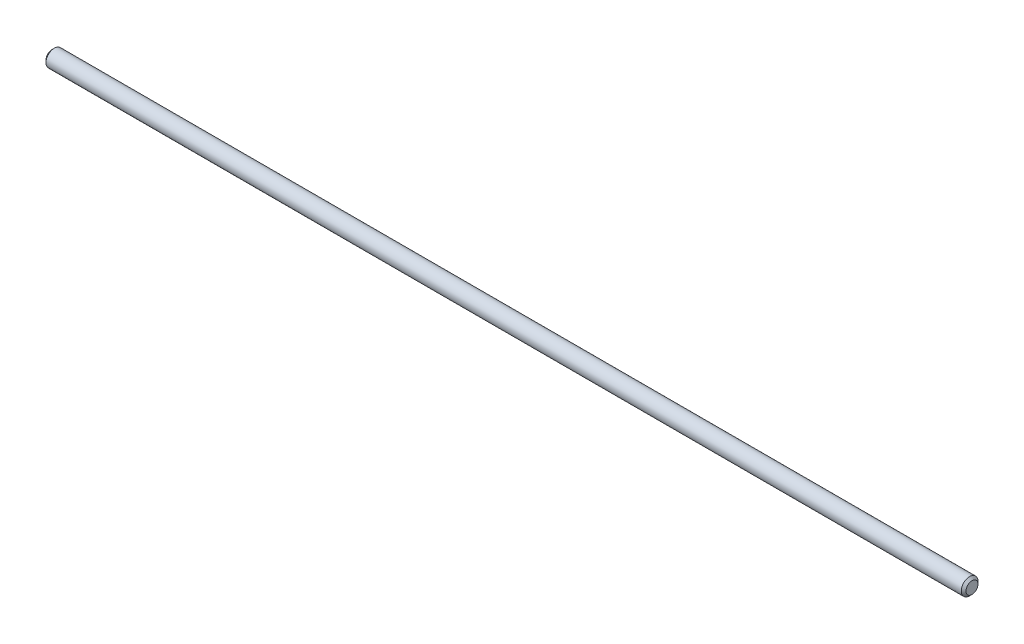
ISO-10303-21;
HEADER;
FILE_DESCRIPTION(('STEP AP214'),'2;1');
FILE_NAME('part.step','',(''),(''),'','','');
FILE_SCHEMA(('AUTOMOTIVE_DESIGN { 1 0 10303 214 1 1 1 1 }'));
ENDSEC;
DATA;
#1=APPLICATION_CONTEXT('core data for automotive mechanical design processes');
#2=APPLICATION_PROTOCOL_DEFINITION('international standard','automotive_design',2000,#1);
#3=PRODUCT_CONTEXT('',#1,'mechanical');
#4=PRODUCT('Part','Part','',(#3));
#5=PRODUCT_RELATED_PRODUCT_CATEGORY('part','',(#4));
#6=PRODUCT_DEFINITION_FORMATION('','',#4);
#7=PRODUCT_DEFINITION_CONTEXT('part definition',#1,'design');
#8=PRODUCT_DEFINITION('design','',#6,#7);
#9=PRODUCT_DEFINITION_SHAPE('','',#8);
#10=(LENGTH_UNIT() NAMED_UNIT(*) SI_UNIT(.MILLI.,.METRE.));
#11=(NAMED_UNIT(*) PLANE_ANGLE_UNIT() SI_UNIT($,.RADIAN.));
#12=(NAMED_UNIT(*) SI_UNIT($,.STERADIAN.) SOLID_ANGLE_UNIT());
#13=UNCERTAINTY_MEASURE_WITH_UNIT(LENGTH_MEASURE(1.E-05),#10,'distance_accuracy_value','');
#14=(GEOMETRIC_REPRESENTATION_CONTEXT(3) GLOBAL_UNCERTAINTY_ASSIGNED_CONTEXT((#13)) GLOBAL_UNIT_ASSIGNED_CONTEXT((#10,
#11,#12)) REPRESENTATION_CONTEXT('',''));
#15=CARTESIAN_POINT('',(0.,0.,0.));
#16=DIRECTION('',(0.,0.,1.));
#17=DIRECTION('',(1.,0.,0.));
#18=AXIS2_PLACEMENT_3D('',#15,#16,#17);
#19=CARTESIAN_POINT('',(-114.3,0.,0.));
#20=DIRECTION('',(1.,0.,0.));
#21=DIRECTION('',(0.,0.,-1.));
#22=AXIS2_PLACEMENT_3D('',#19,#20,#21);
#23=CYLINDRICAL_SURFACE('',#22,2.0828);
#24=CARTESIAN_POINT('',(-113.7046875,0.,0.));
#25=DIRECTION('',(1.,0.,0.));
#26=DIRECTION('',(0.,0.,-1.));
#27=AXIS2_PLACEMENT_3D('',#24,#25,#26);
#28=CIRCLE('',#27,2.0828);
#29=CARTESIAN_POINT('',(-113.7046875,0.,-2.0828));
#30=VERTEX_POINT('',#29);
#31=EDGE_CURVE('E50',#30,#30,#28,.T.);
#32=ORIENTED_EDGE('',*,*,#31,.T.);
#33=EDGE_LOOP('',(#32));
#34=FACE_BOUND('',#33,.T.);
#35=CARTESIAN_POINT('',(113.7046875,0.,0.));
#36=DIRECTION('',(1.,0.,0.));
#37=DIRECTION('',(0.,0.,-1.));
#38=AXIS2_PLACEMENT_3D('',#35,#36,#37);
#39=CIRCLE('',#38,2.0828);
#40=CARTESIAN_POINT('',(113.7046875,0.,-2.0828));
#41=VERTEX_POINT('',#40);
#42=EDGE_CURVE('E55',#41,#41,#39,.F.);
#43=ORIENTED_EDGE('',*,*,#42,.T.);
#44=EDGE_LOOP('',(#43));
#45=FACE_BOUND('',#44,.T.);
#46=ADVANCED_FACE('F37',(#34,#45),#23,.T.);
#47=CARTESIAN_POINT('',(-114.3,0.,0.));
#48=DIRECTION('',(1.,0.,0.));
#49=DIRECTION('',(0.,0.,-1.));
#50=AXIS2_PLACEMENT_3D('',#47,#48,#49);
#51=PLANE('',#50);
#52=CARTESIAN_POINT('',(-114.3,0.,0.));
#53=DIRECTION('',(1.,0.,0.));
#54=DIRECTION('',(0.,0.,-1.));
#55=AXIS2_PLACEMENT_3D('',#52,#53,#54);
#56=CIRCLE('',#55,1.48748750000005);
#57=CARTESIAN_POINT('',(-114.3,0.,-1.48748750000005));
#58=VERTEX_POINT('',#57);
#59=EDGE_CURVE('E45',#58,#58,#56,.F.);
#60=ORIENTED_EDGE('',*,*,#59,.T.);
#61=EDGE_LOOP('',(#60));
#62=FACE_BOUND('',#61,.T.);
#63=ADVANCED_FACE('F72',(#62),#51,.F.);
#64=CARTESIAN_POINT('',(114.3,0.,0.));
#65=DIRECTION('',(1.,0.,0.));
#66=DIRECTION('',(0.,0.,-1.));
#67=AXIS2_PLACEMENT_3D('',#64,#65,#66);
#68=PLANE('',#67);
#69=CARTESIAN_POINT('',(114.3,0.,0.));
#70=DIRECTION('',(1.,0.,0.));
#71=DIRECTION('',(0.,0.,-1.));
#72=AXIS2_PLACEMENT_3D('',#69,#70,#71);
#73=CIRCLE('',#72,1.48748750000002);
#74=CARTESIAN_POINT('',(114.3,0.,-1.48748750000002));
#75=VERTEX_POINT('',#74);
#76=EDGE_CURVE('E10',#75,#75,#73,.T.);
#77=ORIENTED_EDGE('',*,*,#76,.T.);
#78=EDGE_LOOP('',(#77));
#79=FACE_BOUND('',#78,.T.);
#80=ADVANCED_FACE('F69',(#79),#68,.T.);
#81=CARTESIAN_POINT('',(-113.7046875,0.,0.));
#82=DIRECTION('',(1.,0.,0.));
#83=DIRECTION('',(0.,0.,-1.));
#84=AXIS2_PLACEMENT_3D('',#81,#82,#83);
#85=CONICAL_SURFACE('',#84,2.0828,0.78539816339744);
#86=ORIENTED_EDGE('',*,*,#59,.F.);
#87=EDGE_LOOP('',(#86));
#88=FACE_BOUND('',#87,.T.);
#89=ORIENTED_EDGE('',*,*,#31,.F.);
#90=EDGE_LOOP('',(#89));
#91=FACE_BOUND('',#90,.T.);
#92=ADVANCED_FACE('F65',(#88,#91),#85,.T.);
#93=CARTESIAN_POINT('',(114.3,0.,0.));
#94=DIRECTION('',(-1.,0.,0.));
#95=DIRECTION('',(0.,0.,1.));
#96=AXIS2_PLACEMENT_3D('',#93,#94,#95);
#97=CONICAL_SURFACE('',#96,1.48748750000002,0.785398163397429);
#98=ORIENTED_EDGE('',*,*,#42,.F.);
#99=EDGE_LOOP('',(#98));
#100=FACE_BOUND('',#99,.T.);
#101=ORIENTED_EDGE('',*,*,#76,.F.);
#102=EDGE_LOOP('',(#101));
#103=FACE_BOUND('',#102,.T.);
#104=ADVANCED_FACE('F39',(#100,#103),#97,.T.);
#105=CLOSED_SHELL('',(#46,#63,#80,#92,#104));
#106=MANIFOLD_SOLID_BREP('B2',#105);
#107=ADVANCED_BREP_SHAPE_REPRESENTATION('',(#18,#106),#14);
#108=SHAPE_DEFINITION_REPRESENTATION(#9,#107);
ENDSEC;
END-ISO-10303-21;
